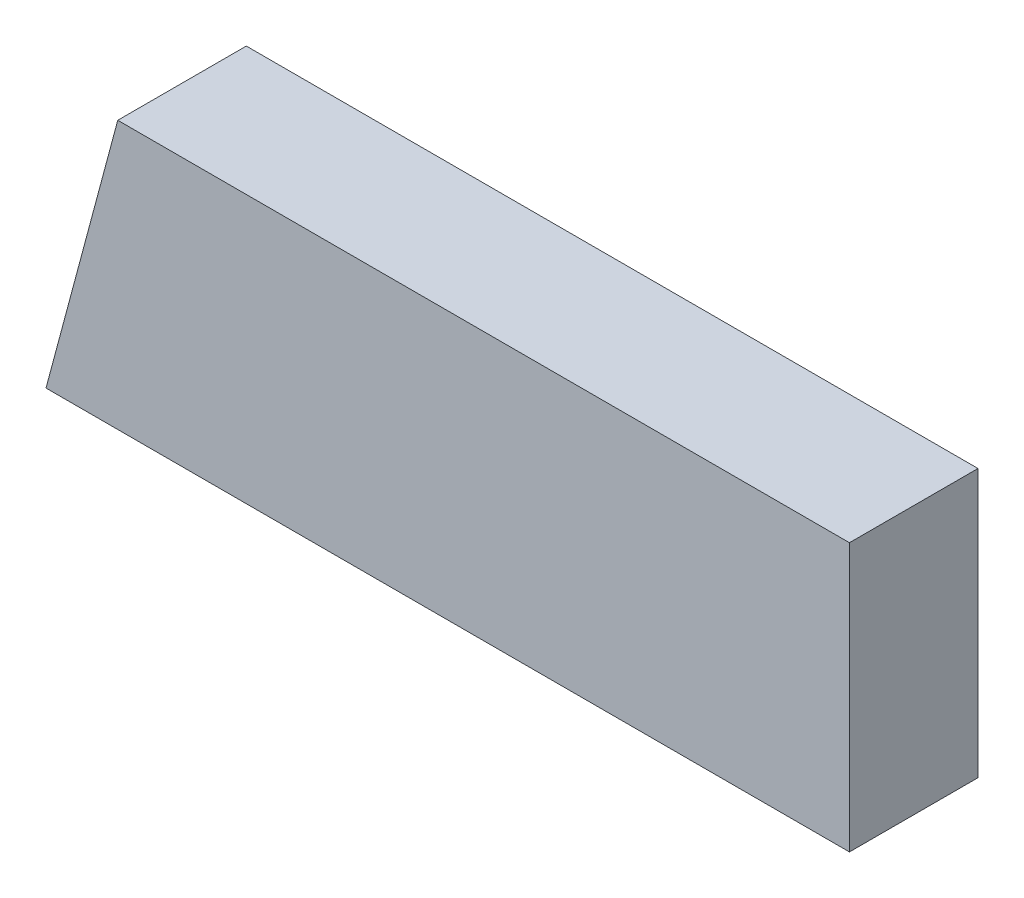
ISO-10303-21;
HEADER;
FILE_DESCRIPTION(('STEP AP214'),'2;1');
FILE_NAME('part.step','',(''),(''),'','','');
FILE_SCHEMA(('AUTOMOTIVE_DESIGN { 1 0 10303 214 1 1 1 1 }'));
ENDSEC;
DATA;
#1=APPLICATION_CONTEXT('core data for automotive mechanical design processes');
#2=APPLICATION_PROTOCOL_DEFINITION('international standard','automotive_design',2000,#1);
#3=PRODUCT_CONTEXT('',#1,'mechanical');
#4=PRODUCT('Part','Part','',(#3));
#5=PRODUCT_RELATED_PRODUCT_CATEGORY('part','',(#4));
#6=PRODUCT_DEFINITION_FORMATION('','',#4);
#7=PRODUCT_DEFINITION_CONTEXT('part definition',#1,'design');
#8=PRODUCT_DEFINITION('design','',#6,#7);
#9=PRODUCT_DEFINITION_SHAPE('','',#8);
#10=(LENGTH_UNIT() NAMED_UNIT(*) SI_UNIT(.MILLI.,.METRE.));
#11=(NAMED_UNIT(*) PLANE_ANGLE_UNIT() SI_UNIT($,.RADIAN.));
#12=(NAMED_UNIT(*) SI_UNIT($,.STERADIAN.) SOLID_ANGLE_UNIT());
#13=UNCERTAINTY_MEASURE_WITH_UNIT(LENGTH_MEASURE(1.E-05),#10,'distance_accuracy_value','');
#14=(GEOMETRIC_REPRESENTATION_CONTEXT(3) GLOBAL_UNCERTAINTY_ASSIGNED_CONTEXT((#13)) GLOBAL_UNIT_ASSIGNED_CONTEXT((#10,
#11,#12)) REPRESENTATION_CONTEXT('',''));
#15=CARTESIAN_POINT('',(0.,0.,0.));
#16=DIRECTION('',(0.,0.,1.));
#17=DIRECTION('',(1.,0.,0.));
#18=AXIS2_PLACEMENT_3D('',#15,#16,#17);
#19=CARTESIAN_POINT('',(-40.6589718578347,-11.4732634511342,-12.));
#20=DIRECTION('',(0.965925826289072,-0.258819045102508,0.));
#21=DIRECTION('',(0.258819045102508,0.965925826289072,0.));
#22=AXIS2_PLACEMENT_3D('',#19,#20,#21);
#23=PLANE('',#22);
#24=DIRECTION('',(0.258819045102508,0.965925826289072,0.));
#25=VECTOR('',#24,1.);
#26=CARTESIAN_POINT('',(-40.6589718578347,-11.4732634511342,0.));
#27=LINE('',#26,#25);
#28=CARTESIAN_POINT('',(-40.6589718578347,-11.4732634511342,0.));
#29=VERTEX_POINT('',#28);
#30=CARTESIAN_POINT('',(-33.9602420470569,13.5267365488659,0.));
#31=VERTEX_POINT('',#30);
#32=EDGE_CURVE('E94',#29,#31,#27,.T.);
#33=ORIENTED_EDGE('',*,*,#32,.T.);
#34=DIRECTION('',(0.,0.,1.));
#35=VECTOR('',#34,1.);
#36=CARTESIAN_POINT('',(-33.9602420470569,13.5267365488659,-12.));
#37=LINE('',#36,#35);
#38=CARTESIAN_POINT('',(-33.9602420470569,13.5267365488659,-12.));
#39=VERTEX_POINT('',#38);
#40=EDGE_CURVE('E11',#39,#31,#37,.T.);
#41=ORIENTED_EDGE('',*,*,#40,.F.);
#42=DIRECTION('',(0.258819045102508,0.965925826289072,0.));
#43=VECTOR('',#42,1.);
#44=CARTESIAN_POINT('',(-40.6589718578347,-11.4732634511342,-12.));
#45=LINE('',#44,#43);
#46=CARTESIAN_POINT('',(-40.6589718578347,-11.4732634511342,-12.));
#47=VERTEX_POINT('',#46);
#48=EDGE_CURVE('E79',#47,#39,#45,.T.);
#49=ORIENTED_EDGE('',*,*,#48,.F.);
#50=DIRECTION('',(0.,0.,1.));
#51=VECTOR('',#50,1.);
#52=CARTESIAN_POINT('',(-40.6589718578347,-11.4732634511342,-12.));
#53=LINE('',#52,#51);
#54=EDGE_CURVE('E90',#47,#29,#53,.T.);
#55=ORIENTED_EDGE('',*,*,#54,.T.);
#56=EDGE_LOOP('',(#33,#41,#49,#55));
#57=FACE_BOUND('',#56,.T.);
#58=ADVANCED_FACE('F32',(#57),#23,.F.);
#59=CARTESIAN_POINT('',(-33.9602420470569,13.5267365488659,-12.));
#60=DIRECTION('',(0.,-1.,0.));
#61=DIRECTION('',(1.,0.,0.));
#62=AXIS2_PLACEMENT_3D('',#59,#60,#61);
#63=PLANE('',#62);
#64=DIRECTION('',(1.,0.,0.));
#65=VECTOR('',#64,1.);
#66=CARTESIAN_POINT('',(-33.9602420470569,13.5267365488659,0.));
#67=LINE('',#66,#65);
#68=CARTESIAN_POINT('',(34.3410281421651,13.5267365488666,0.));
#69=VERTEX_POINT('',#68);
#70=EDGE_CURVE('E84',#31,#69,#67,.T.);
#71=ORIENTED_EDGE('',*,*,#70,.T.);
#72=DIRECTION('',(0.,0.,1.));
#73=VECTOR('',#72,1.);
#74=CARTESIAN_POINT('',(34.3410281421651,13.5267365488666,-12.));
#75=LINE('',#74,#73);
#76=CARTESIAN_POINT('',(34.3410281421651,13.5267365488666,-12.));
#77=VERTEX_POINT('',#76);
#78=EDGE_CURVE('E40',#77,#69,#75,.T.);
#79=ORIENTED_EDGE('',*,*,#78,.F.);
#80=DIRECTION('',(1.,0.,0.));
#81=VECTOR('',#80,1.);
#82=CARTESIAN_POINT('',(-33.9602420470569,13.5267365488659,-12.));
#83=LINE('',#82,#81);
#84=EDGE_CURVE('E74',#39,#77,#83,.T.);
#85=ORIENTED_EDGE('',*,*,#84,.F.);
#86=ORIENTED_EDGE('',*,*,#40,.T.);
#87=EDGE_LOOP('',(#71,#79,#85,#86));
#88=FACE_BOUND('',#87,.T.);
#89=ADVANCED_FACE('F83',(#88),#63,.F.);
#90=CARTESIAN_POINT('',(34.3410281421654,-11.4732634511334,-12.));
#91=DIRECTION('',(1.,0.,0.));
#92=DIRECTION('',(0.,1.,0.));
#93=AXIS2_PLACEMENT_3D('',#90,#91,#92);
#94=PLANE('',#93);
#95=DIRECTION('',(0.,1.,0.));
#96=VECTOR('',#95,1.);
#97=CARTESIAN_POINT('',(34.3410281421654,-11.4732634511334,0.));
#98=LINE('',#97,#96);
#99=CARTESIAN_POINT('',(34.3410281421654,-11.4732634511334,0.));
#100=VERTEX_POINT('',#99);
#101=EDGE_CURVE('E98',#100,#69,#98,.T.);
#102=ORIENTED_EDGE('',*,*,#101,.F.);
#103=DIRECTION('',(0.,0.,1.));
#104=VECTOR('',#103,1.);
#105=CARTESIAN_POINT('',(34.3410281421654,-11.4732634511334,-12.));
#106=LINE('',#105,#104);
#107=CARTESIAN_POINT('',(34.3410281421654,-11.4732634511334,-12.));
#108=VERTEX_POINT('',#107);
#109=EDGE_CURVE('E64',#108,#100,#106,.T.);
#110=ORIENTED_EDGE('',*,*,#109,.F.);
#111=DIRECTION('',(0.,1.,0.));
#112=VECTOR('',#111,1.);
#113=CARTESIAN_POINT('',(34.3410281421654,-11.4732634511334,-12.));
#114=LINE('',#113,#112);
#115=EDGE_CURVE('E77',#108,#77,#114,.T.);
#116=ORIENTED_EDGE('',*,*,#115,.T.);
#117=ORIENTED_EDGE('',*,*,#78,.T.);
#118=EDGE_LOOP('',(#102,#110,#116,#117));
#119=FACE_BOUND('',#118,.T.);
#120=ADVANCED_FACE('F88',(#119),#94,.T.);
#121=CARTESIAN_POINT('',(34.3410281421654,-11.4732634511334,-12.));
#122=DIRECTION('',(0.,1.,0.));
#123=DIRECTION('',(-1.,0.,0.));
#124=AXIS2_PLACEMENT_3D('',#121,#122,#123);
#125=PLANE('',#124);
#126=DIRECTION('',(-1.,0.,0.));
#127=VECTOR('',#126,1.);
#128=CARTESIAN_POINT('',(34.3410281421654,-11.4732634511334,0.));
#129=LINE('',#128,#127);
#130=EDGE_CURVE('E67',#100,#29,#129,.T.);
#131=ORIENTED_EDGE('',*,*,#130,.T.);
#132=ORIENTED_EDGE('',*,*,#54,.F.);
#133=DIRECTION('',(-1.,0.,0.));
#134=VECTOR('',#133,1.);
#135=CARTESIAN_POINT('',(34.3410281421654,-11.4732634511334,-12.));
#136=LINE('',#135,#134);
#137=EDGE_CURVE('E48',#108,#47,#136,.T.);
#138=ORIENTED_EDGE('',*,*,#137,.F.);
#139=ORIENTED_EDGE('',*,*,#109,.T.);
#140=EDGE_LOOP('',(#131,#132,#138,#139));
#141=FACE_BOUND('',#140,.T.);
#142=ADVANCED_FACE('F111',(#141),#125,.F.);
#143=CARTESIAN_POINT('',(0.,0.,-12.));
#144=DIRECTION('',(0.,0.,-1.));
#145=DIRECTION('',(-1.,0.,0.));
#146=AXIS2_PLACEMENT_3D('',#143,#144,#145);
#147=PLANE('',#146);
#148=ORIENTED_EDGE('',*,*,#48,.T.);
#149=ORIENTED_EDGE('',*,*,#84,.T.);
#150=ORIENTED_EDGE('',*,*,#115,.F.);
#151=ORIENTED_EDGE('',*,*,#137,.T.);
#152=EDGE_LOOP('',(#148,#149,#150,#151));
#153=FACE_BOUND('',#152,.T.);
#154=ADVANCED_FACE('F75',(#153),#147,.T.);
#155=CARTESIAN_POINT('',(0.,0.,0.));
#156=DIRECTION('',(0.,0.,-1.));
#157=DIRECTION('',(-1.,0.,0.));
#158=AXIS2_PLACEMENT_3D('',#155,#156,#157);
#159=PLANE('',#158);
#160=ORIENTED_EDGE('',*,*,#32,.F.);
#161=ORIENTED_EDGE('',*,*,#130,.F.);
#162=ORIENTED_EDGE('',*,*,#101,.T.);
#163=ORIENTED_EDGE('',*,*,#70,.F.);
#164=EDGE_LOOP('',(#160,#161,#162,#163));
#165=FACE_BOUND('',#164,.T.);
#166=ADVANCED_FACE('F105',(#165),#159,.F.);
#167=CLOSED_SHELL('',(#58,#89,#120,#142,#154,#166));
#168=MANIFOLD_SOLID_BREP('B2',#167);
#169=ADVANCED_BREP_SHAPE_REPRESENTATION('',(#18,#168),#14);
#170=SHAPE_DEFINITION_REPRESENTATION(#9,#169);
ENDSEC;
END-ISO-10303-21;
